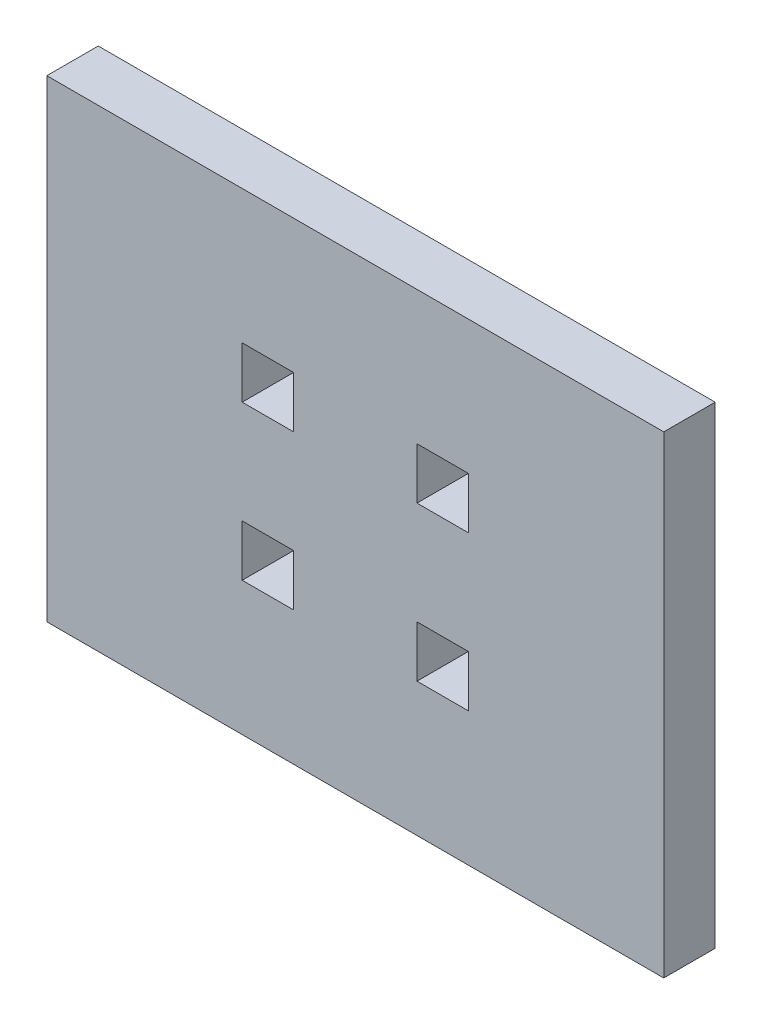
ISO-10303-21;
HEADER;
FILE_DESCRIPTION(('STEP AP214'),'2;1');
FILE_NAME('part.step','',(''),(''),'','','');
FILE_SCHEMA(('AUTOMOTIVE_DESIGN { 1 0 10303 214 1 1 1 1 }'));
ENDSEC;
DATA;
#1=APPLICATION_CONTEXT('core data for automotive mechanical design processes');
#2=APPLICATION_PROTOCOL_DEFINITION('international standard','automotive_design',2000,#1);
#3=PRODUCT_CONTEXT('',#1,'mechanical');
#4=PRODUCT('Part','Part','',(#3));
#5=PRODUCT_RELATED_PRODUCT_CATEGORY('part','',(#4));
#6=PRODUCT_DEFINITION_FORMATION('','',#4);
#7=PRODUCT_DEFINITION_CONTEXT('part definition',#1,'design');
#8=PRODUCT_DEFINITION('design','',#6,#7);
#9=PRODUCT_DEFINITION_SHAPE('','',#8);
#10=(LENGTH_UNIT() NAMED_UNIT(*) SI_UNIT(.MILLI.,.METRE.));
#11=(NAMED_UNIT(*) PLANE_ANGLE_UNIT() SI_UNIT($,.RADIAN.));
#12=(NAMED_UNIT(*) SI_UNIT($,.STERADIAN.) SOLID_ANGLE_UNIT());
#13=UNCERTAINTY_MEASURE_WITH_UNIT(LENGTH_MEASURE(1.E-05),#10,'distance_accuracy_value','');
#14=(GEOMETRIC_REPRESENTATION_CONTEXT(3) GLOBAL_UNCERTAINTY_ASSIGNED_CONTEXT((#13)) GLOBAL_UNIT_ASSIGNED_CONTEXT((#10,
#11,#12)) REPRESENTATION_CONTEXT('',''));
#15=CARTESIAN_POINT('',(0.,0.,0.));
#16=DIRECTION('',(0.,0.,1.));
#17=DIRECTION('',(1.,0.,0.));
#18=AXIS2_PLACEMENT_3D('',#15,#16,#17);
#19=CARTESIAN_POINT('',(26.1064070545439,0.,5.));
#20=DIRECTION('',(1.,0.,0.));
#21=DIRECTION('',(0.,1.,0.));
#22=AXIS2_PLACEMENT_3D('',#19,#20,#21);
#23=PLANE('',#22);
#24=DIRECTION('',(0.,-1.,0.));
#25=VECTOR('',#24,1.);
#26=CARTESIAN_POINT('',(26.1064070545439,0.,0.));
#27=LINE('',#26,#25);
#28=CARTESIAN_POINT('',(26.1064070545439,38.1875,0.));
#29=VERTEX_POINT('',#28);
#30=CARTESIAN_POINT('',(26.1064070545439,-7.8125,0.));
#31=VERTEX_POINT('',#30);
#32=EDGE_CURVE('E250',#29,#31,#27,.T.);
#33=ORIENTED_EDGE('',*,*,#32,.F.);
#34=DIRECTION('',(0.,0.,-1.));
#35=VECTOR('',#34,1.);
#36=CARTESIAN_POINT('',(26.1064070545439,38.1875,5.));
#37=LINE('',#36,#35);
#38=CARTESIAN_POINT('',(26.1064070545439,38.1875,5.));
#39=VERTEX_POINT('',#38);
#40=EDGE_CURVE('E11',#39,#29,#37,.T.);
#41=ORIENTED_EDGE('',*,*,#40,.F.);
#42=DIRECTION('',(0.,-1.,0.));
#43=VECTOR('',#42,1.);
#44=CARTESIAN_POINT('',(26.1064070545439,0.,5.));
#45=LINE('',#44,#43);
#46=CARTESIAN_POINT('',(26.1064070545439,-7.8125,5.));
#47=VERTEX_POINT('',#46);
#48=EDGE_CURVE('E200',#39,#47,#45,.T.);
#49=ORIENTED_EDGE('',*,*,#48,.T.);
#50=DIRECTION('',(0.,0.,-1.));
#51=VECTOR('',#50,1.);
#52=CARTESIAN_POINT('',(26.1064070545439,-7.8125,5.));
#53=LINE('',#52,#51);
#54=EDGE_CURVE('E125',#47,#31,#53,.T.);
#55=ORIENTED_EDGE('',*,*,#54,.T.);
#56=EDGE_LOOP('',(#33,#41,#49,#55));
#57=FACE_BOUND('',#56,.T.);
#58=ADVANCED_FACE('F35',(#57),#23,.T.);
#59=CARTESIAN_POINT('',(0.,38.1875,5.));
#60=DIRECTION('',(0.,1.,0.));
#61=DIRECTION('',(0.,0.,1.));
#62=AXIS2_PLACEMENT_3D('',#59,#60,#61);
#63=PLANE('',#62);
#64=DIRECTION('',(1.,0.,0.));
#65=VECTOR('',#64,1.);
#66=CARTESIAN_POINT('',(0.,38.1875,0.));
#67=LINE('',#66,#65);
#68=CARTESIAN_POINT('',(-33.8935929454561,38.1875,0.));
#69=VERTEX_POINT('',#68);
#70=EDGE_CURVE('E190',#69,#29,#67,.T.);
#71=ORIENTED_EDGE('',*,*,#70,.F.);
#72=DIRECTION('',(0.,0.,-1.));
#73=VECTOR('',#72,1.);
#74=CARTESIAN_POINT('',(-33.8935929454561,38.1875,5.));
#75=LINE('',#74,#73);
#76=CARTESIAN_POINT('',(-33.8935929454561,38.1875,5.));
#77=VERTEX_POINT('',#76);
#78=EDGE_CURVE('E45',#77,#69,#75,.T.);
#79=ORIENTED_EDGE('',*,*,#78,.F.);
#80=DIRECTION('',(1.,0.,0.));
#81=VECTOR('',#80,1.);
#82=CARTESIAN_POINT('',(0.,38.1875,5.));
#83=LINE('',#82,#81);
#84=EDGE_CURVE('E188',#77,#39,#83,.T.);
#85=ORIENTED_EDGE('',*,*,#84,.T.);
#86=ORIENTED_EDGE('',*,*,#40,.T.);
#87=EDGE_LOOP('',(#71,#79,#85,#86));
#88=FACE_BOUND('',#87,.T.);
#89=ADVANCED_FACE('F186',(#88),#63,.T.);
#90=CARTESIAN_POINT('',(-33.8935929454561,0.,5.));
#91=DIRECTION('',(1.,0.,0.));
#92=DIRECTION('',(0.,1.,0.));
#93=AXIS2_PLACEMENT_3D('',#90,#91,#92);
#94=PLANE('',#93);
#95=DIRECTION('',(0.,-1.,0.));
#96=VECTOR('',#95,1.);
#97=CARTESIAN_POINT('',(-33.8935929454561,0.,0.));
#98=LINE('',#97,#96);
#99=CARTESIAN_POINT('',(-33.8935929454561,-7.8125,0.));
#100=VERTEX_POINT('',#99);
#101=EDGE_CURVE('E253',#69,#100,#98,.T.);
#102=ORIENTED_EDGE('',*,*,#101,.T.);
#103=DIRECTION('',(0.,0.,-1.));
#104=VECTOR('',#103,1.);
#105=CARTESIAN_POINT('',(-33.8935929454561,-7.8125,5.));
#106=LINE('',#105,#104);
#107=CARTESIAN_POINT('',(-33.8935929454561,-7.8125,5.));
#108=VERTEX_POINT('',#107);
#109=EDGE_CURVE('E193',#108,#100,#106,.T.);
#110=ORIENTED_EDGE('',*,*,#109,.F.);
#111=DIRECTION('',(0.,-1.,0.));
#112=VECTOR('',#111,1.);
#113=CARTESIAN_POINT('',(-33.8935929454561,0.,5.));
#114=LINE('',#113,#112);
#115=EDGE_CURVE('E196',#77,#108,#114,.T.);
#116=ORIENTED_EDGE('',*,*,#115,.F.);
#117=ORIENTED_EDGE('',*,*,#78,.T.);
#118=EDGE_LOOP('',(#102,#110,#116,#117));
#119=FACE_BOUND('',#118,.T.);
#120=ADVANCED_FACE('F197',(#119),#94,.F.);
#121=CARTESIAN_POINT('',(2.10640705454386,0.,5.));
#122=DIRECTION('',(1.,0.,0.));
#123=DIRECTION('',(0.,1.,0.));
#124=AXIS2_PLACEMENT_3D('',#121,#122,#123);
#125=PLANE('',#124);
#126=DIRECTION('',(0.,-1.,0.));
#127=VECTOR('',#126,1.);
#128=CARTESIAN_POINT('',(2.10640705454386,0.,0.));
#129=LINE('',#128,#127);
#130=CARTESIAN_POINT('',(2.10640705454386,25.1875,0.));
#131=VERTEX_POINT('',#130);
#132=CARTESIAN_POINT('',(2.10640705454386,20.1875,0.));
#133=VERTEX_POINT('',#132);
#134=EDGE_CURVE('E215',#131,#133,#129,.T.);
#135=ORIENTED_EDGE('',*,*,#134,.F.);
#136=DIRECTION('',(0.,0.,-1.));
#137=VECTOR('',#136,1.);
#138=CARTESIAN_POINT('',(2.10640705454386,25.1875,5.));
#139=LINE('',#138,#137);
#140=CARTESIAN_POINT('',(2.10640705454386,25.1875,5.));
#141=VERTEX_POINT('',#140);
#142=EDGE_CURVE('E257',#141,#131,#139,.T.);
#143=ORIENTED_EDGE('',*,*,#142,.F.);
#144=DIRECTION('',(0.,-1.,0.));
#145=VECTOR('',#144,1.);
#146=CARTESIAN_POINT('',(2.10640705454386,0.,5.));
#147=LINE('',#146,#145);
#148=CARTESIAN_POINT('',(2.10640705454386,20.1875,5.));
#149=VERTEX_POINT('',#148);
#150=EDGE_CURVE('E336',#141,#149,#147,.T.);
#151=ORIENTED_EDGE('',*,*,#150,.T.);
#152=DIRECTION('',(0.,0.,-1.));
#153=VECTOR('',#152,1.);
#154=CARTESIAN_POINT('',(2.10640705454386,20.1875,5.));
#155=LINE('',#154,#153);
#156=EDGE_CURVE('E259',#149,#133,#155,.T.);
#157=ORIENTED_EDGE('',*,*,#156,.T.);
#158=EDGE_LOOP('',(#135,#143,#151,#157));
#159=FACE_BOUND('',#158,.T.);
#160=ADVANCED_FACE('F352',(#159),#125,.T.);
#161=CARTESIAN_POINT('',(0.,25.1875,5.));
#162=DIRECTION('',(0.,1.,0.));
#163=DIRECTION('',(-1.,0.,0.));
#164=AXIS2_PLACEMENT_3D('',#161,#162,#163);
#165=PLANE('',#164);
#166=DIRECTION('',(1.,0.,0.));
#167=VECTOR('',#166,1.);
#168=CARTESIAN_POINT('',(0.,25.1875,0.));
#169=LINE('',#168,#167);
#170=CARTESIAN_POINT('',(7.10640705454386,25.1875,0.));
#171=VERTEX_POINT('',#170);
#172=EDGE_CURVE('E241',#131,#171,#169,.T.);
#173=ORIENTED_EDGE('',*,*,#172,.T.);
#174=DIRECTION('',(0.,0.,-1.));
#175=VECTOR('',#174,1.);
#176=CARTESIAN_POINT('',(7.10640705454386,25.1875,5.));
#177=LINE('',#176,#175);
#178=CARTESIAN_POINT('',(7.10640705454386,25.1875,5.));
#179=VERTEX_POINT('',#178);
#180=EDGE_CURVE('E265',#179,#171,#177,.T.);
#181=ORIENTED_EDGE('',*,*,#180,.F.);
#182=DIRECTION('',(1.,0.,0.));
#183=VECTOR('',#182,1.);
#184=CARTESIAN_POINT('',(0.,25.1875,5.));
#185=LINE('',#184,#183);
#186=EDGE_CURVE('E337',#141,#179,#185,.T.);
#187=ORIENTED_EDGE('',*,*,#186,.F.);
#188=ORIENTED_EDGE('',*,*,#142,.T.);
#189=EDGE_LOOP('',(#173,#181,#187,#188));
#190=FACE_BOUND('',#189,.T.);
#191=ADVANCED_FACE('F358',(#190),#165,.F.);
#192=CARTESIAN_POINT('',(7.10640705454386,0.,5.));
#193=DIRECTION('',(1.,0.,0.));
#194=DIRECTION('',(0.,0.,-1.));
#195=AXIS2_PLACEMENT_3D('',#192,#193,#194);
#196=PLANE('',#195);
#197=DIRECTION('',(0.,-1.,0.));
#198=VECTOR('',#197,1.);
#199=CARTESIAN_POINT('',(7.10640705454386,0.,0.));
#200=LINE('',#199,#198);
#201=CARTESIAN_POINT('',(7.10640705454386,20.1875,0.));
#202=VERTEX_POINT('',#201);
#203=EDGE_CURVE('E244',#171,#202,#200,.T.);
#204=ORIENTED_EDGE('',*,*,#203,.T.);
#205=DIRECTION('',(0.,0.,-1.));
#206=VECTOR('',#205,1.);
#207=CARTESIAN_POINT('',(7.10640705454386,20.1875,5.));
#208=LINE('',#207,#206);
#209=CARTESIAN_POINT('',(7.10640705454386,20.1875,5.));
#210=VERTEX_POINT('',#209);
#211=EDGE_CURVE('E261',#210,#202,#208,.T.);
#212=ORIENTED_EDGE('',*,*,#211,.F.);
#213=DIRECTION('',(0.,-1.,0.));
#214=VECTOR('',#213,1.);
#215=CARTESIAN_POINT('',(7.10640705454386,0.,5.));
#216=LINE('',#215,#214);
#217=EDGE_CURVE('E340',#179,#210,#216,.T.);
#218=ORIENTED_EDGE('',*,*,#217,.F.);
#219=ORIENTED_EDGE('',*,*,#180,.T.);
#220=EDGE_LOOP('',(#204,#212,#218,#219));
#221=FACE_BOUND('',#220,.T.);
#222=ADVANCED_FACE('F360',(#221),#196,.F.);
#223=CARTESIAN_POINT('',(0.,25.1875,5.));
#224=DIRECTION('',(0.,-1.,0.));
#225=DIRECTION('',(1.,0.,0.));
#226=AXIS2_PLACEMENT_3D('',#223,#224,#225);
#227=PLANE('',#226);
#228=DIRECTION('',(-1.,0.,0.));
#229=VECTOR('',#228,1.);
#230=CARTESIAN_POINT('',(0.,25.1875,0.));
#231=LINE('',#230,#229);
#232=CARTESIAN_POINT('',(-9.89359294545614,25.1875,0.));
#233=VERTEX_POINT('',#232);
#234=CARTESIAN_POINT('',(-14.8935929454561,25.1875,0.));
#235=VERTEX_POINT('',#234);
#236=EDGE_CURVE('E232',#233,#235,#231,.T.);
#237=ORIENTED_EDGE('',*,*,#236,.F.);
#238=DIRECTION('',(0.,0.,-1.));
#239=VECTOR('',#238,1.);
#240=CARTESIAN_POINT('',(-9.89359294545614,25.1875,5.));
#241=LINE('',#240,#239);
#242=CARTESIAN_POINT('',(-9.89359294545614,25.1875,5.));
#243=VERTEX_POINT('',#242);
#244=EDGE_CURVE('E262',#243,#233,#241,.T.);
#245=ORIENTED_EDGE('',*,*,#244,.F.);
#246=DIRECTION('',(-1.,0.,0.));
#247=VECTOR('',#246,1.);
#248=CARTESIAN_POINT('',(0.,25.1875,5.));
#249=LINE('',#248,#247);
#250=CARTESIAN_POINT('',(-14.8935929454561,25.1875,5.));
#251=VERTEX_POINT('',#250);
#252=EDGE_CURVE('E327',#243,#251,#249,.T.);
#253=ORIENTED_EDGE('',*,*,#252,.T.);
#254=DIRECTION('',(0.,0.,-1.));
#255=VECTOR('',#254,1.);
#256=CARTESIAN_POINT('',(-14.8935929454561,25.1875,5.));
#257=LINE('',#256,#255);
#258=EDGE_CURVE('E269',#251,#235,#257,.T.);
#259=ORIENTED_EDGE('',*,*,#258,.T.);
#260=EDGE_LOOP('',(#237,#245,#253,#259));
#261=FACE_BOUND('',#260,.T.);
#262=ADVANCED_FACE('F377',(#261),#227,.T.);
#263=CARTESIAN_POINT('',(-9.89359294545614,0.,5.));
#264=DIRECTION('',(1.,0.,0.));
#265=DIRECTION('',(0.,1.,0.));
#266=AXIS2_PLACEMENT_3D('',#263,#264,#265);
#267=PLANE('',#266);
#268=DIRECTION('',(0.,-1.,0.));
#269=VECTOR('',#268,1.);
#270=CARTESIAN_POINT('',(-9.89359294545614,0.,0.));
#271=LINE('',#270,#269);
#272=CARTESIAN_POINT('',(-9.89359294545614,20.1875,0.));
#273=VERTEX_POINT('',#272);
#274=EDGE_CURVE('E226',#233,#273,#271,.T.);
#275=ORIENTED_EDGE('',*,*,#274,.T.);
#276=DIRECTION('',(0.,0.,-1.));
#277=VECTOR('',#276,1.);
#278=CARTESIAN_POINT('',(-9.89359294545614,20.1875,5.));
#279=LINE('',#278,#277);
#280=CARTESIAN_POINT('',(-9.89359294545614,20.1875,5.));
#281=VERTEX_POINT('',#280);
#282=EDGE_CURVE('E274',#281,#273,#279,.T.);
#283=ORIENTED_EDGE('',*,*,#282,.F.);
#284=DIRECTION('',(0.,-1.,0.));
#285=VECTOR('',#284,1.);
#286=CARTESIAN_POINT('',(-9.89359294545614,0.,5.));
#287=LINE('',#286,#285);
#288=EDGE_CURVE('E321',#243,#281,#287,.T.);
#289=ORIENTED_EDGE('',*,*,#288,.F.);
#290=ORIENTED_EDGE('',*,*,#244,.T.);
#291=EDGE_LOOP('',(#275,#283,#289,#290));
#292=FACE_BOUND('',#291,.T.);
#293=ADVANCED_FACE('F390',(#292),#267,.F.);
#294=CARTESIAN_POINT('',(0.,20.1875,5.));
#295=DIRECTION('',(0.,1.,0.));
#296=DIRECTION('',(0.,0.,1.));
#297=AXIS2_PLACEMENT_3D('',#294,#295,#296);
#298=PLANE('',#297);
#299=DIRECTION('',(1.,0.,0.));
#300=VECTOR('',#299,1.);
#301=CARTESIAN_POINT('',(0.,20.1875,0.));
#302=LINE('',#301,#300);
#303=CARTESIAN_POINT('',(-14.8935929454561,20.1875,0.));
#304=VERTEX_POINT('',#303);
#305=EDGE_CURVE('E235',#304,#273,#302,.T.);
#306=ORIENTED_EDGE('',*,*,#305,.F.);
#307=DIRECTION('',(0.,0.,-1.));
#308=VECTOR('',#307,1.);
#309=CARTESIAN_POINT('',(-14.8935929454561,20.1875,5.));
#310=LINE('',#309,#308);
#311=CARTESIAN_POINT('',(-14.8935929454561,20.1875,5.));
#312=VERTEX_POINT('',#311);
#313=EDGE_CURVE('E271',#312,#304,#310,.T.);
#314=ORIENTED_EDGE('',*,*,#313,.F.);
#315=DIRECTION('',(1.,0.,0.));
#316=VECTOR('',#315,1.);
#317=CARTESIAN_POINT('',(0.,20.1875,5.));
#318=LINE('',#317,#316);
#319=EDGE_CURVE('E330',#312,#281,#318,.T.);
#320=ORIENTED_EDGE('',*,*,#319,.T.);
#321=ORIENTED_EDGE('',*,*,#282,.T.);
#322=EDGE_LOOP('',(#306,#314,#320,#321));
#323=FACE_BOUND('',#322,.T.);
#324=ADVANCED_FACE('F386',(#323),#298,.T.);
#325=CARTESIAN_POINT('',(0.,10.1875,5.));
#326=DIRECTION('',(0.,-1.,0.));
#327=DIRECTION('',(1.,0.,0.));
#328=AXIS2_PLACEMENT_3D('',#325,#326,#327);
#329=PLANE('',#328);
#330=DIRECTION('',(-1.,0.,0.));
#331=VECTOR('',#330,1.);
#332=CARTESIAN_POINT('',(0.,10.1875,0.));
#333=LINE('',#332,#331);
#334=CARTESIAN_POINT('',(-9.89359294545614,10.1875,0.));
#335=VERTEX_POINT('',#334);
#336=CARTESIAN_POINT('',(-14.8935929454561,10.1875,0.));
#337=VERTEX_POINT('',#336);
#338=EDGE_CURVE('E219',#335,#337,#333,.T.);
#339=ORIENTED_EDGE('',*,*,#338,.F.);
#340=DIRECTION('',(0.,0.,-1.));
#341=VECTOR('',#340,1.);
#342=CARTESIAN_POINT('',(-9.89359294545614,10.1875,5.));
#343=LINE('',#342,#341);
#344=CARTESIAN_POINT('',(-9.89359294545614,10.1875,5.));
#345=VERTEX_POINT('',#344);
#346=EDGE_CURVE('E272',#345,#335,#343,.T.);
#347=ORIENTED_EDGE('',*,*,#346,.F.);
#348=DIRECTION('',(-1.,0.,0.));
#349=VECTOR('',#348,1.);
#350=CARTESIAN_POINT('',(0.,10.1875,5.));
#351=LINE('',#350,#349);
#352=CARTESIAN_POINT('',(-14.8935929454561,10.1875,5.));
#353=VERTEX_POINT('',#352);
#354=EDGE_CURVE('E310',#345,#353,#351,.T.);
#355=ORIENTED_EDGE('',*,*,#354,.T.);
#356=DIRECTION('',(0.,0.,-1.));
#357=VECTOR('',#356,1.);
#358=CARTESIAN_POINT('',(-14.8935929454561,10.1875,5.));
#359=LINE('',#358,#357);
#360=EDGE_CURVE('E277',#353,#337,#359,.T.);
#361=ORIENTED_EDGE('',*,*,#360,.T.);
#362=EDGE_LOOP('',(#339,#347,#355,#361));
#363=FACE_BOUND('',#362,.T.);
#364=ADVANCED_FACE('F389',(#363),#329,.T.);
#365=CARTESIAN_POINT('',(-9.89359294545614,5.1875,0.));
#366=VERTEX_POINT('',#365);
#367=EDGE_CURVE('E222',#335,#366,#271,.T.);
#368=ORIENTED_EDGE('',*,*,#367,.T.);
#369=DIRECTION('',(0.,0.,-1.));
#370=VECTOR('',#369,1.);
#371=CARTESIAN_POINT('',(-9.89359294545614,5.1875,5.));
#372=LINE('',#371,#370);
#373=CARTESIAN_POINT('',(-9.89359294545614,5.1875,5.));
#374=VERTEX_POINT('',#373);
#375=EDGE_CURVE('E281',#374,#366,#372,.T.);
#376=ORIENTED_EDGE('',*,*,#375,.F.);
#377=EDGE_CURVE('E314',#345,#374,#287,.T.);
#378=ORIENTED_EDGE('',*,*,#377,.F.);
#379=ORIENTED_EDGE('',*,*,#346,.T.);
#380=EDGE_LOOP('',(#368,#376,#378,#379));
#381=FACE_BOUND('',#380,.T.);
#382=ADVANCED_FACE('F395',(#381),#267,.F.);
#383=CARTESIAN_POINT('',(0.,5.18749999999999,5.));
#384=DIRECTION('',(0.,1.,0.));
#385=DIRECTION('',(-1.,0.,0.));
#386=AXIS2_PLACEMENT_3D('',#383,#384,#385);
#387=PLANE('',#386);
#388=DIRECTION('',(1.,0.,0.));
#389=VECTOR('',#388,1.);
#390=CARTESIAN_POINT('',(0.,5.18749999999999,0.));
#391=LINE('',#390,#389);
#392=CARTESIAN_POINT('',(-14.8935929454561,5.1875,0.));
#393=VERTEX_POINT('',#392);
#394=EDGE_CURVE('E225',#393,#366,#391,.T.);
#395=ORIENTED_EDGE('',*,*,#394,.F.);
#396=DIRECTION('',(0.,0.,-1.));
#397=VECTOR('',#396,1.);
#398=CARTESIAN_POINT('',(-14.8935929454561,5.1875,5.));
#399=LINE('',#398,#397);
#400=CARTESIAN_POINT('',(-14.8935929454561,5.1875,5.));
#401=VERTEX_POINT('',#400);
#402=EDGE_CURVE('E279',#401,#393,#399,.T.);
#403=ORIENTED_EDGE('',*,*,#402,.F.);
#404=DIRECTION('',(1.,0.,0.));
#405=VECTOR('',#404,1.);
#406=CARTESIAN_POINT('',(0.,5.18749999999999,5.));
#407=LINE('',#406,#405);
#408=EDGE_CURVE('E320',#401,#374,#407,.T.);
#409=ORIENTED_EDGE('',*,*,#408,.T.);
#410=ORIENTED_EDGE('',*,*,#375,.T.);
#411=EDGE_LOOP('',(#395,#403,#409,#410));
#412=FACE_BOUND('',#411,.T.);
#413=ADVANCED_FACE('F402',(#412),#387,.T.);
#414=CARTESIAN_POINT('',(0.,5.1875,5.));
#415=DIRECTION('',(0.,-1.,0.));
#416=DIRECTION('',(1.,0.,0.));
#417=AXIS2_PLACEMENT_3D('',#414,#415,#416);
#418=PLANE('',#417);
#419=DIRECTION('',(-1.,0.,0.));
#420=VECTOR('',#419,1.);
#421=CARTESIAN_POINT('',(0.,5.1875,0.));
#422=LINE('',#421,#420);
#423=CARTESIAN_POINT('',(7.10640705454386,5.1875,0.));
#424=VERTEX_POINT('',#423);
#425=CARTESIAN_POINT('',(2.10640705454386,5.1875,0.));
#426=VERTEX_POINT('',#425);
#427=EDGE_CURVE('E208',#424,#426,#422,.T.);
#428=ORIENTED_EDGE('',*,*,#427,.T.);
#429=DIRECTION('',(0.,0.,-1.));
#430=VECTOR('',#429,1.);
#431=CARTESIAN_POINT('',(2.10640705454386,5.1875,5.));
#432=LINE('',#431,#430);
#433=CARTESIAN_POINT('',(2.10640705454386,5.1875,5.));
#434=VERTEX_POINT('',#433);
#435=EDGE_CURVE('E39',#434,#426,#432,.T.);
#436=ORIENTED_EDGE('',*,*,#435,.F.);
#437=DIRECTION('',(-1.,0.,0.));
#438=VECTOR('',#437,1.);
#439=CARTESIAN_POINT('',(0.,5.1875,5.));
#440=LINE('',#439,#438);
#441=CARTESIAN_POINT('',(7.10640705454386,5.1875,5.));
#442=VERTEX_POINT('',#441);
#443=EDGE_CURVE('E133',#442,#434,#440,.T.);
#444=ORIENTED_EDGE('',*,*,#443,.F.);
#445=DIRECTION('',(0.,0.,-1.));
#446=VECTOR('',#445,1.);
#447=CARTESIAN_POINT('',(7.10640705454386,5.1875,5.));
#448=LINE('',#447,#446);
#449=EDGE_CURVE('E207',#442,#424,#448,.T.);
#450=ORIENTED_EDGE('',*,*,#449,.T.);
#451=EDGE_LOOP('',(#428,#436,#444,#450));
#452=FACE_BOUND('',#451,.T.);
#453=ADVANCED_FACE('F37',(#452),#418,.F.);
#454=CARTESIAN_POINT('',(2.10640705454386,10.1875,0.));
#455=VERTEX_POINT('',#454);
#456=EDGE_CURVE('E211',#455,#426,#129,.T.);
#457=ORIENTED_EDGE('',*,*,#456,.F.);
#458=DIRECTION('',(0.,0.,-1.));
#459=VECTOR('',#458,1.);
#460=CARTESIAN_POINT('',(2.10640705454386,10.1875,5.));
#461=LINE('',#460,#459);
#462=CARTESIAN_POINT('',(2.10640705454386,10.1875,5.));
#463=VERTEX_POINT('',#462);
#464=EDGE_CURVE('E288',#463,#455,#461,.T.);
#465=ORIENTED_EDGE('',*,*,#464,.F.);
#466=EDGE_CURVE('E296',#463,#434,#147,.T.);
#467=ORIENTED_EDGE('',*,*,#466,.T.);
#468=ORIENTED_EDGE('',*,*,#435,.T.);
#469=EDGE_LOOP('',(#457,#465,#467,#468));
#470=FACE_BOUND('',#469,.T.);
#471=ADVANCED_FACE('F295',(#470),#125,.T.);
#472=CARTESIAN_POINT('',(0.,10.1875,5.));
#473=DIRECTION('',(0.,1.,0.));
#474=DIRECTION('',(-1.,0.,0.));
#475=AXIS2_PLACEMENT_3D('',#472,#473,#474);
#476=PLANE('',#475);
#477=DIRECTION('',(1.,0.,0.));
#478=VECTOR('',#477,1.);
#479=CARTESIAN_POINT('',(0.,10.1875,0.));
#480=LINE('',#479,#478);
#481=CARTESIAN_POINT('',(7.10640705454386,10.1875,0.));
#482=VERTEX_POINT('',#481);
#483=EDGE_CURVE('E214',#455,#482,#480,.T.);
#484=ORIENTED_EDGE('',*,*,#483,.T.);
#485=DIRECTION('',(0.,0.,-1.));
#486=VECTOR('',#485,1.);
#487=CARTESIAN_POINT('',(7.10640705454386,10.1875,5.));
#488=LINE('',#487,#486);
#489=CARTESIAN_POINT('',(7.10640705454386,10.1875,5.));
#490=VERTEX_POINT('',#489);
#491=EDGE_CURVE('E286',#490,#482,#488,.T.);
#492=ORIENTED_EDGE('',*,*,#491,.F.);
#493=DIRECTION('',(1.,0.,0.));
#494=VECTOR('',#493,1.);
#495=CARTESIAN_POINT('',(0.,10.1875,5.));
#496=LINE('',#495,#494);
#497=EDGE_CURVE('E311',#463,#490,#496,.T.);
#498=ORIENTED_EDGE('',*,*,#497,.F.);
#499=ORIENTED_EDGE('',*,*,#464,.T.);
#500=EDGE_LOOP('',(#484,#492,#498,#499));
#501=FACE_BOUND('',#500,.T.);
#502=ADVANCED_FACE('F305',(#501),#476,.F.);
#503=CARTESIAN_POINT('',(0.,20.1875,5.));
#504=DIRECTION('',(0.,-1.,0.));
#505=DIRECTION('',(0.,0.,-1.));
#506=AXIS2_PLACEMENT_3D('',#503,#504,#505);
#507=PLANE('',#506);
#508=DIRECTION('',(-1.,0.,0.));
#509=VECTOR('',#508,1.);
#510=CARTESIAN_POINT('',(0.,20.1875,0.));
#511=LINE('',#510,#509);
#512=EDGE_CURVE('E247',#202,#133,#511,.T.);
#513=ORIENTED_EDGE('',*,*,#512,.T.);
#514=ORIENTED_EDGE('',*,*,#156,.F.);
#515=DIRECTION('',(-1.,0.,0.));
#516=VECTOR('',#515,1.);
#517=CARTESIAN_POINT('',(0.,20.1875,5.));
#518=LINE('',#517,#516);
#519=EDGE_CURVE('E202',#210,#149,#518,.T.);
#520=ORIENTED_EDGE('',*,*,#519,.F.);
#521=ORIENTED_EDGE('',*,*,#211,.T.);
#522=EDGE_LOOP('',(#513,#514,#520,#521));
#523=FACE_BOUND('',#522,.T.);
#524=ADVANCED_FACE('F348',(#523),#507,.F.);
#525=CARTESIAN_POINT('',(-14.8935929454561,0.,5.));
#526=DIRECTION('',(1.,0.,0.));
#527=DIRECTION('',(0.,0.,-1.));
#528=AXIS2_PLACEMENT_3D('',#525,#526,#527);
#529=PLANE('',#528);
#530=DIRECTION('',(0.,-1.,0.));
#531=VECTOR('',#530,1.);
#532=CARTESIAN_POINT('',(-14.8935929454561,0.,0.));
#533=LINE('',#532,#531);
#534=EDGE_CURVE('E238',#235,#304,#533,.T.);
#535=ORIENTED_EDGE('',*,*,#534,.F.);
#536=ORIENTED_EDGE('',*,*,#258,.F.);
#537=DIRECTION('',(0.,-1.,0.));
#538=VECTOR('',#537,1.);
#539=CARTESIAN_POINT('',(-14.8935929454561,0.,5.));
#540=LINE('',#539,#538);
#541=EDGE_CURVE('E333',#251,#312,#540,.T.);
#542=ORIENTED_EDGE('',*,*,#541,.T.);
#543=ORIENTED_EDGE('',*,*,#313,.T.);
#544=EDGE_LOOP('',(#535,#536,#542,#543));
#545=FACE_BOUND('',#544,.T.);
#546=ADVANCED_FACE('F374',(#545),#529,.T.);
#547=CARTESIAN_POINT('',(-14.8935929454561,0.,5.));
#548=DIRECTION('',(1.,0.,0.));
#549=DIRECTION('',(0.,0.,-1.));
#550=AXIS2_PLACEMENT_3D('',#547,#548,#549);
#551=PLANE('',#550);
#552=DIRECTION('',(0.,-1.,0.));
#553=VECTOR('',#552,1.);
#554=CARTESIAN_POINT('',(-14.8935929454561,0.,0.));
#555=LINE('',#554,#553);
#556=EDGE_CURVE('E229',#337,#393,#555,.T.);
#557=ORIENTED_EDGE('',*,*,#556,.F.);
#558=ORIENTED_EDGE('',*,*,#360,.F.);
#559=DIRECTION('',(0.,-1.,0.));
#560=VECTOR('',#559,1.);
#561=CARTESIAN_POINT('',(-14.8935929454561,0.,5.));
#562=LINE('',#561,#560);
#563=EDGE_CURVE('E324',#353,#401,#562,.T.);
#564=ORIENTED_EDGE('',*,*,#563,.T.);
#565=ORIENTED_EDGE('',*,*,#402,.T.);
#566=EDGE_LOOP('',(#557,#558,#564,#565));
#567=FACE_BOUND('',#566,.T.);
#568=ADVANCED_FACE('F384',(#567),#551,.T.);
#569=CARTESIAN_POINT('',(7.10640705454386,0.,5.));
#570=DIRECTION('',(1.,0.,0.));
#571=DIRECTION('',(0.,0.,-1.));
#572=AXIS2_PLACEMENT_3D('',#569,#570,#571);
#573=PLANE('',#572);
#574=DIRECTION('',(0.,-1.,0.));
#575=VECTOR('',#574,1.);
#576=CARTESIAN_POINT('',(7.10640705454386,0.,0.));
#577=LINE('',#576,#575);
#578=EDGE_CURVE('E217',#482,#424,#577,.T.);
#579=ORIENTED_EDGE('',*,*,#578,.T.);
#580=ORIENTED_EDGE('',*,*,#449,.F.);
#581=DIRECTION('',(0.,-1.,0.));
#582=VECTOR('',#581,1.);
#583=CARTESIAN_POINT('',(7.10640705454386,0.,5.));
#584=LINE('',#583,#582);
#585=EDGE_CURVE('E309',#490,#442,#584,.T.);
#586=ORIENTED_EDGE('',*,*,#585,.F.);
#587=ORIENTED_EDGE('',*,*,#491,.T.);
#588=EDGE_LOOP('',(#579,#580,#586,#587));
#589=FACE_BOUND('',#588,.T.);
#590=ADVANCED_FACE('F308',(#589),#573,.F.);
#591=CARTESIAN_POINT('',(0.,-7.8125,5.));
#592=DIRECTION('',(0.,1.,0.));
#593=DIRECTION('',(0.,0.,1.));
#594=AXIS2_PLACEMENT_3D('',#591,#592,#593);
#595=PLANE('',#594);
#596=DIRECTION('',(1.,0.,0.));
#597=VECTOR('',#596,1.);
#598=CARTESIAN_POINT('',(0.,-7.8125,0.));
#599=LINE('',#598,#597);
#600=EDGE_CURVE('E118',#100,#31,#599,.T.);
#601=ORIENTED_EDGE('',*,*,#600,.T.);
#602=ORIENTED_EDGE('',*,*,#54,.F.);
#603=DIRECTION('',(1.,0.,0.));
#604=VECTOR('',#603,1.);
#605=CARTESIAN_POINT('',(0.,-7.8125,5.));
#606=LINE('',#605,#604);
#607=EDGE_CURVE('E54',#108,#47,#606,.T.);
#608=ORIENTED_EDGE('',*,*,#607,.F.);
#609=ORIENTED_EDGE('',*,*,#109,.T.);
#610=EDGE_LOOP('',(#601,#602,#608,#609));
#611=FACE_BOUND('',#610,.T.);
#612=ADVANCED_FACE('F410',(#611),#595,.F.);
#613=CARTESIAN_POINT('',(0.,0.,5.));
#614=DIRECTION('',(0.,0.,1.));
#615=DIRECTION('',(1.,0.,0.));
#616=AXIS2_PLACEMENT_3D('',#613,#614,#615);
#617=PLANE('',#616);
#618=ORIENTED_EDGE('',*,*,#443,.T.);
#619=ORIENTED_EDGE('',*,*,#466,.F.);
#620=ORIENTED_EDGE('',*,*,#497,.T.);
#621=ORIENTED_EDGE('',*,*,#585,.T.);
#622=EDGE_LOOP('',(#618,#619,#620,#621));
#623=FACE_BOUND('',#622,.T.);
#624=ORIENTED_EDGE('',*,*,#354,.F.);
#625=ORIENTED_EDGE('',*,*,#377,.T.);
#626=ORIENTED_EDGE('',*,*,#408,.F.);
#627=ORIENTED_EDGE('',*,*,#563,.F.);
#628=EDGE_LOOP('',(#624,#625,#626,#627));
#629=FACE_BOUND('',#628,.T.);
#630=ORIENTED_EDGE('',*,*,#252,.F.);
#631=ORIENTED_EDGE('',*,*,#288,.T.);
#632=ORIENTED_EDGE('',*,*,#319,.F.);
#633=ORIENTED_EDGE('',*,*,#541,.F.);
#634=EDGE_LOOP('',(#630,#631,#632,#633));
#635=FACE_BOUND('',#634,.T.);
#636=ORIENTED_EDGE('',*,*,#150,.F.);
#637=ORIENTED_EDGE('',*,*,#186,.T.);
#638=ORIENTED_EDGE('',*,*,#217,.T.);
#639=ORIENTED_EDGE('',*,*,#519,.T.);
#640=EDGE_LOOP('',(#636,#637,#638,#639));
#641=FACE_BOUND('',#640,.T.);
#642=ORIENTED_EDGE('',*,*,#48,.F.);
#643=ORIENTED_EDGE('',*,*,#84,.F.);
#644=ORIENTED_EDGE('',*,*,#115,.T.);
#645=ORIENTED_EDGE('',*,*,#607,.T.);
#646=EDGE_LOOP('',(#642,#643,#644,#645));
#647=FACE_BOUND('',#646,.T.);
#648=ADVANCED_FACE('F199',(#623,#629,#635,#641,#647),#617,.T.);
#649=CARTESIAN_POINT('',(0.,0.,0.));
#650=DIRECTION('',(0.,0.,1.));
#651=DIRECTION('',(1.,0.,0.));
#652=AXIS2_PLACEMENT_3D('',#649,#650,#651);
#653=PLANE('',#652);
#654=ORIENTED_EDGE('',*,*,#427,.F.);
#655=ORIENTED_EDGE('',*,*,#578,.F.);
#656=ORIENTED_EDGE('',*,*,#483,.F.);
#657=ORIENTED_EDGE('',*,*,#456,.T.);
#658=EDGE_LOOP('',(#654,#655,#656,#657));
#659=FACE_BOUND('',#658,.T.);
#660=ORIENTED_EDGE('',*,*,#338,.T.);
#661=ORIENTED_EDGE('',*,*,#556,.T.);
#662=ORIENTED_EDGE('',*,*,#394,.T.);
#663=ORIENTED_EDGE('',*,*,#367,.F.);
#664=EDGE_LOOP('',(#660,#661,#662,#663));
#665=FACE_BOUND('',#664,.T.);
#666=ORIENTED_EDGE('',*,*,#236,.T.);
#667=ORIENTED_EDGE('',*,*,#534,.T.);
#668=ORIENTED_EDGE('',*,*,#305,.T.);
#669=ORIENTED_EDGE('',*,*,#274,.F.);
#670=EDGE_LOOP('',(#666,#667,#668,#669));
#671=FACE_BOUND('',#670,.T.);
#672=ORIENTED_EDGE('',*,*,#134,.T.);
#673=ORIENTED_EDGE('',*,*,#512,.F.);
#674=ORIENTED_EDGE('',*,*,#203,.F.);
#675=ORIENTED_EDGE('',*,*,#172,.F.);
#676=EDGE_LOOP('',(#672,#673,#674,#675));
#677=FACE_BOUND('',#676,.T.);
#678=ORIENTED_EDGE('',*,*,#32,.T.);
#679=ORIENTED_EDGE('',*,*,#600,.F.);
#680=ORIENTED_EDGE('',*,*,#101,.F.);
#681=ORIENTED_EDGE('',*,*,#70,.T.);
#682=EDGE_LOOP('',(#678,#679,#680,#681));
#683=FACE_BOUND('',#682,.T.);
#684=ADVANCED_FACE('F302',(#659,#665,#671,#677,#683),#653,.F.);
#685=CLOSED_SHELL('',(#58,#89,#120,#160,#191,#222,#262,#293,#324,#364,#382,#413,#453,#471,#502,
#524,#546,#568,#590,#612,#648,#684));
#686=MANIFOLD_SOLID_BREP('B2',#685);
#687=ADVANCED_BREP_SHAPE_REPRESENTATION('',(#18,#686),#14);
#688=SHAPE_DEFINITION_REPRESENTATION(#9,#687);
ENDSEC;
END-ISO-10303-21;
